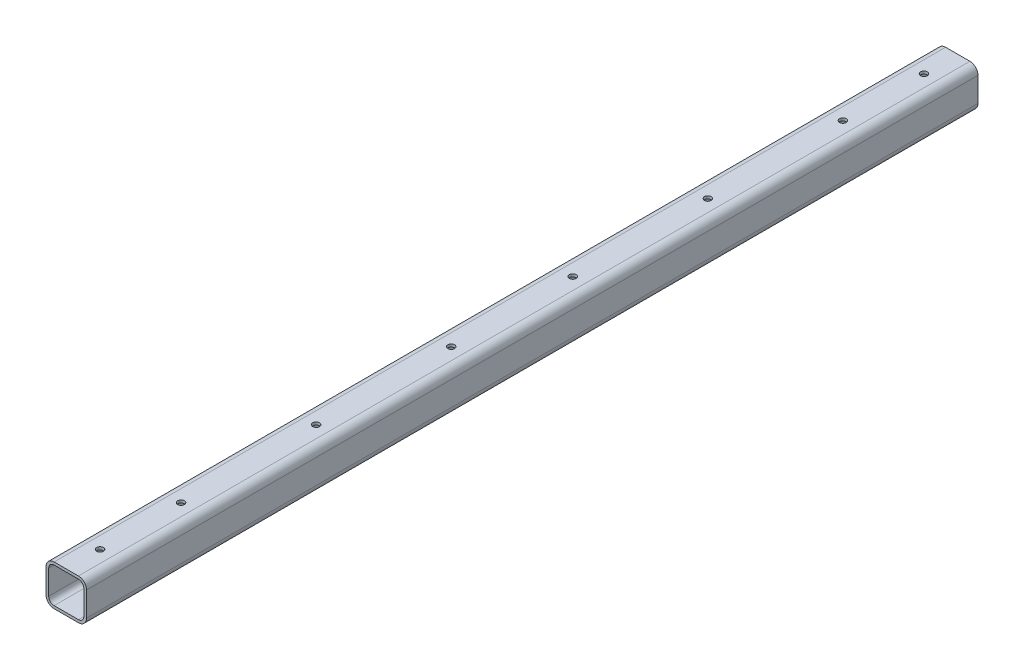
ISO-10303-21;
HEADER;
FILE_DESCRIPTION(('STEP AP214'),'2;1');
FILE_NAME('part.step','',(''),(''),'','','');
FILE_SCHEMA(('AUTOMOTIVE_DESIGN { 1 0 10303 214 1 1 1 1 }'));
ENDSEC;
DATA;
#1=APPLICATION_CONTEXT('core data for automotive mechanical design processes');
#2=APPLICATION_PROTOCOL_DEFINITION('international standard','automotive_design',2000,#1);
#3=PRODUCT_CONTEXT('',#1,'mechanical');
#4=PRODUCT('Part','Part','',(#3));
#5=PRODUCT_RELATED_PRODUCT_CATEGORY('part','',(#4));
#6=PRODUCT_DEFINITION_FORMATION('','',#4);
#7=PRODUCT_DEFINITION_CONTEXT('part definition',#1,'design');
#8=PRODUCT_DEFINITION('design','',#6,#7);
#9=PRODUCT_DEFINITION_SHAPE('','',#8);
#10=(LENGTH_UNIT() NAMED_UNIT(*) SI_UNIT(.MILLI.,.METRE.));
#11=(NAMED_UNIT(*) PLANE_ANGLE_UNIT() SI_UNIT($,.RADIAN.));
#12=(NAMED_UNIT(*) SI_UNIT($,.STERADIAN.) SOLID_ANGLE_UNIT());
#13=UNCERTAINTY_MEASURE_WITH_UNIT(LENGTH_MEASURE(1.E-05),#10,'distance_accuracy_value','');
#14=(GEOMETRIC_REPRESENTATION_CONTEXT(3) GLOBAL_UNCERTAINTY_ASSIGNED_CONTEXT((#13)) GLOBAL_UNIT_ASSIGNED_CONTEXT((#10,
#11,#12)) REPRESENTATION_CONTEXT('',''));
#15=CARTESIAN_POINT('',(0.,0.,0.));
#16=DIRECTION('',(0.,0.,1.));
#17=DIRECTION('',(1.,0.,0.));
#18=AXIS2_PLACEMENT_3D('',#15,#16,#17);
#19=CARTESIAN_POINT('',(9.,9.,330.));
#20=DIRECTION('',(0.,0.,-1.));
#21=DIRECTION('',(-1.,0.,0.));
#22=AXIS2_PLACEMENT_3D('',#19,#20,#21);
#23=PLANE('',#22);
#24=CARTESIAN_POINT('',(9.,9.,330.));
#25=DIRECTION('',(0.,0.,1.));
#26=DIRECTION('',(-1.,0.,0.));
#27=AXIS2_PLACEMENT_3D('',#24,#25,#26);
#28=CIRCLE('',#27,6.);
#29=CARTESIAN_POINT('',(15.,9.,330.));
#30=VERTEX_POINT('',#29);
#31=CARTESIAN_POINT('',(9.,15.,330.));
#32=VERTEX_POINT('',#31);
#33=EDGE_CURVE('E223',#30,#32,#28,.T.);
#34=ORIENTED_EDGE('',*,*,#33,.T.);
#35=DIRECTION('',(-1.,0.,0.));
#36=VECTOR('',#35,1.);
#37=CARTESIAN_POINT('',(-9.,15.,330.));
#38=LINE('',#37,#36);
#39=CARTESIAN_POINT('',(-9.,15.,330.));
#40=VERTEX_POINT('',#39);
#41=EDGE_CURVE('E226',#32,#40,#38,.T.);
#42=ORIENTED_EDGE('',*,*,#41,.T.);
#43=CARTESIAN_POINT('',(-9.,9.,330.));
#44=DIRECTION('',(0.,0.,1.));
#45=DIRECTION('',(1.,0.,0.));
#46=AXIS2_PLACEMENT_3D('',#43,#44,#45);
#47=CIRCLE('',#46,6.);
#48=CARTESIAN_POINT('',(-15.,9.,330.));
#49=VERTEX_POINT('',#48);
#50=EDGE_CURVE('E229',#40,#49,#47,.T.);
#51=ORIENTED_EDGE('',*,*,#50,.T.);
#52=DIRECTION('',(0.,-1.,0.));
#53=VECTOR('',#52,1.);
#54=CARTESIAN_POINT('',(-15.,9.,330.));
#55=LINE('',#54,#53);
#56=CARTESIAN_POINT('',(-15.,-9.,330.));
#57=VERTEX_POINT('',#56);
#58=EDGE_CURVE('E231',#49,#57,#55,.T.);
#59=ORIENTED_EDGE('',*,*,#58,.T.);
#60=CARTESIAN_POINT('',(-9.,-9.,330.));
#61=DIRECTION('',(0.,0.,1.));
#62=DIRECTION('',(-1.,0.,0.));
#63=AXIS2_PLACEMENT_3D('',#60,#61,#62);
#64=CIRCLE('',#63,6.);
#65=CARTESIAN_POINT('',(-9.,-15.,330.));
#66=VERTEX_POINT('',#65);
#67=EDGE_CURVE('E233',#57,#66,#64,.T.);
#68=ORIENTED_EDGE('',*,*,#67,.T.);
#69=DIRECTION('',(1.,0.,0.));
#70=VECTOR('',#69,1.);
#71=CARTESIAN_POINT('',(-9.,-15.,330.));
#72=LINE('',#71,#70);
#73=CARTESIAN_POINT('',(9.,-15.,330.));
#74=VERTEX_POINT('',#73);
#75=EDGE_CURVE('E235',#66,#74,#72,.T.);
#76=ORIENTED_EDGE('',*,*,#75,.T.);
#77=CARTESIAN_POINT('',(9.,-9.,330.));
#78=DIRECTION('',(0.,0.,1.));
#79=DIRECTION('',(1.,0.,0.));
#80=AXIS2_PLACEMENT_3D('',#77,#78,#79);
#81=CIRCLE('',#80,6.);
#82=CARTESIAN_POINT('',(15.,-9.,330.));
#83=VERTEX_POINT('',#82);
#84=EDGE_CURVE('E237',#74,#83,#81,.T.);
#85=ORIENTED_EDGE('',*,*,#84,.T.);
#86=DIRECTION('',(0.,1.,0.));
#87=VECTOR('',#86,1.);
#88=CARTESIAN_POINT('',(15.,9.,330.));
#89=LINE('',#88,#87);
#90=EDGE_CURVE('E239',#83,#30,#89,.T.);
#91=ORIENTED_EDGE('',*,*,#90,.T.);
#92=EDGE_LOOP('',(#34,#42,#51,#59,#68,#76,#85,#91));
#93=FACE_BOUND('',#92,.T.);
#94=CARTESIAN_POINT('',(-9.,9.,330.));
#95=DIRECTION('',(0.,0.,1.));
#96=DIRECTION('',(1.,0.,0.));
#97=AXIS2_PLACEMENT_3D('',#94,#95,#96);
#98=CIRCLE('',#97,4.);
#99=CARTESIAN_POINT('',(-9.,13.,330.));
#100=VERTEX_POINT('',#99);
#101=CARTESIAN_POINT('',(-13.,9.,330.));
#102=VERTEX_POINT('',#101);
#103=EDGE_CURVE('E156',#100,#102,#98,.T.);
#104=ORIENTED_EDGE('',*,*,#103,.F.);
#105=DIRECTION('',(-1.,0.,0.));
#106=VECTOR('',#105,1.);
#107=CARTESIAN_POINT('',(-9.,13.,330.));
#108=LINE('',#107,#106);
#109=CARTESIAN_POINT('',(9.,13.,330.));
#110=VERTEX_POINT('',#109);
#111=EDGE_CURVE('E190',#110,#100,#108,.T.);
#112=ORIENTED_EDGE('',*,*,#111,.F.);
#113=CARTESIAN_POINT('',(9.,9.,330.));
#114=DIRECTION('',(0.,0.,1.));
#115=DIRECTION('',(-1.,0.,0.));
#116=AXIS2_PLACEMENT_3D('',#113,#114,#115);
#117=CIRCLE('',#116,4.);
#118=CARTESIAN_POINT('',(13.,9.,330.));
#119=VERTEX_POINT('',#118);
#120=EDGE_CURVE('E188',#119,#110,#117,.T.);
#121=ORIENTED_EDGE('',*,*,#120,.F.);
#122=DIRECTION('',(0.,1.,0.));
#123=VECTOR('',#122,1.);
#124=CARTESIAN_POINT('',(13.,9.,330.));
#125=LINE('',#124,#123);
#126=CARTESIAN_POINT('',(13.,-9.,330.));
#127=VERTEX_POINT('',#126);
#128=EDGE_CURVE('E186',#127,#119,#125,.T.);
#129=ORIENTED_EDGE('',*,*,#128,.F.);
#130=CARTESIAN_POINT('',(9.,-9.,330.));
#131=DIRECTION('',(0.,0.,1.));
#132=DIRECTION('',(1.,0.,0.));
#133=AXIS2_PLACEMENT_3D('',#130,#131,#132);
#134=CIRCLE('',#133,4.);
#135=CARTESIAN_POINT('',(9.,-13.,330.));
#136=VERTEX_POINT('',#135);
#137=EDGE_CURVE('E184',#136,#127,#134,.T.);
#138=ORIENTED_EDGE('',*,*,#137,.F.);
#139=DIRECTION('',(1.,0.,0.));
#140=VECTOR('',#139,1.);
#141=CARTESIAN_POINT('',(-9.,-13.,330.));
#142=LINE('',#141,#140);
#143=CARTESIAN_POINT('',(-9.,-13.,330.));
#144=VERTEX_POINT('',#143);
#145=EDGE_CURVE('E179',#144,#136,#142,.T.);
#146=ORIENTED_EDGE('',*,*,#145,.F.);
#147=CARTESIAN_POINT('',(-9.,-9.,330.));
#148=DIRECTION('',(0.,0.,1.));
#149=DIRECTION('',(-1.,0.,0.));
#150=AXIS2_PLACEMENT_3D('',#147,#148,#149);
#151=CIRCLE('',#150,4.);
#152=CARTESIAN_POINT('',(-13.,-9.,330.));
#153=VERTEX_POINT('',#152);
#154=EDGE_CURVE('E177',#153,#144,#151,.T.);
#155=ORIENTED_EDGE('',*,*,#154,.F.);
#156=DIRECTION('',(0.,-1.,0.));
#157=VECTOR('',#156,1.);
#158=CARTESIAN_POINT('',(-13.,9.,330.));
#159=LINE('',#158,#157);
#160=EDGE_CURVE('E164',#102,#153,#159,.T.);
#161=ORIENTED_EDGE('',*,*,#160,.F.);
#162=EDGE_LOOP('',(#104,#112,#121,#129,#138,#146,#155,#161));
#163=FACE_BOUND('',#162,.T.);
#164=ADVANCED_FACE('F41',(#93,#163),#23,.F.);
#165=CARTESIAN_POINT('',(9.,9.,-330.));
#166=DIRECTION('',(0.,0.,-1.));
#167=DIRECTION('',(-1.,0.,0.));
#168=AXIS2_PLACEMENT_3D('',#165,#166,#167);
#169=PLANE('',#168);
#170=CARTESIAN_POINT('',(9.,9.,-330.));
#171=DIRECTION('',(0.,0.,1.));
#172=DIRECTION('',(-1.,0.,0.));
#173=AXIS2_PLACEMENT_3D('',#170,#171,#172);
#174=CIRCLE('',#173,6.);
#175=CARTESIAN_POINT('',(15.,9.,-330.));
#176=VERTEX_POINT('',#175);
#177=CARTESIAN_POINT('',(9.,15.,-330.));
#178=VERTEX_POINT('',#177);
#179=EDGE_CURVE('E172',#176,#178,#174,.T.);
#180=ORIENTED_EDGE('',*,*,#179,.F.);
#181=DIRECTION('',(0.,1.,0.));
#182=VECTOR('',#181,1.);
#183=CARTESIAN_POINT('',(15.,9.,-330.));
#184=LINE('',#183,#182);
#185=CARTESIAN_POINT('',(15.,-9.,-330.));
#186=VERTEX_POINT('',#185);
#187=EDGE_CURVE('E227',#186,#176,#184,.T.);
#188=ORIENTED_EDGE('',*,*,#187,.F.);
#189=CARTESIAN_POINT('',(9.,-9.,-330.));
#190=DIRECTION('',(0.,0.,1.));
#191=DIRECTION('',(1.,0.,0.));
#192=AXIS2_PLACEMENT_3D('',#189,#190,#191);
#193=CIRCLE('',#192,6.);
#194=CARTESIAN_POINT('',(9.,-15.,-330.));
#195=VERTEX_POINT('',#194);
#196=EDGE_CURVE('E254',#195,#186,#193,.T.);
#197=ORIENTED_EDGE('',*,*,#196,.F.);
#198=DIRECTION('',(1.,0.,0.));
#199=VECTOR('',#198,1.);
#200=CARTESIAN_POINT('',(-9.,-15.,-330.));
#201=LINE('',#200,#199);
#202=CARTESIAN_POINT('',(-9.,-15.,-330.));
#203=VERTEX_POINT('',#202);
#204=EDGE_CURVE('E252',#203,#195,#201,.T.);
#205=ORIENTED_EDGE('',*,*,#204,.F.);
#206=CARTESIAN_POINT('',(-9.,-9.,-330.));
#207=DIRECTION('',(0.,0.,1.));
#208=DIRECTION('',(-1.,0.,0.));
#209=AXIS2_PLACEMENT_3D('',#206,#207,#208);
#210=CIRCLE('',#209,6.);
#211=CARTESIAN_POINT('',(-15.,-9.,-330.));
#212=VERTEX_POINT('',#211);
#213=EDGE_CURVE('E250',#212,#203,#210,.T.);
#214=ORIENTED_EDGE('',*,*,#213,.F.);
#215=DIRECTION('',(0.,-1.,0.));
#216=VECTOR('',#215,1.);
#217=CARTESIAN_POINT('',(-15.,9.,-330.));
#218=LINE('',#217,#216);
#219=CARTESIAN_POINT('',(-15.,9.,-330.));
#220=VERTEX_POINT('',#219);
#221=EDGE_CURVE('E248',#220,#212,#218,.T.);
#222=ORIENTED_EDGE('',*,*,#221,.F.);
#223=CARTESIAN_POINT('',(-9.,9.,-330.));
#224=DIRECTION('',(0.,0.,1.));
#225=DIRECTION('',(1.,0.,0.));
#226=AXIS2_PLACEMENT_3D('',#223,#224,#225);
#227=CIRCLE('',#226,6.);
#228=CARTESIAN_POINT('',(-9.,15.,-330.));
#229=VERTEX_POINT('',#228);
#230=EDGE_CURVE('E246',#229,#220,#227,.T.);
#231=ORIENTED_EDGE('',*,*,#230,.F.);
#232=DIRECTION('',(-1.,0.,0.));
#233=VECTOR('',#232,1.);
#234=CARTESIAN_POINT('',(-9.,15.,-330.));
#235=LINE('',#234,#233);
#236=EDGE_CURVE('E244',#178,#229,#235,.T.);
#237=ORIENTED_EDGE('',*,*,#236,.F.);
#238=EDGE_LOOP('',(#180,#188,#197,#205,#214,#222,#231,#237));
#239=FACE_BOUND('',#238,.T.);
#240=DIRECTION('',(-1.,0.,0.));
#241=VECTOR('',#240,1.);
#242=CARTESIAN_POINT('',(-9.,13.,-330.));
#243=LINE('',#242,#241);
#244=CARTESIAN_POINT('',(9.,13.,-330.));
#245=VERTEX_POINT('',#244);
#246=CARTESIAN_POINT('',(-9.,13.,-330.));
#247=VERTEX_POINT('',#246);
#248=EDGE_CURVE('E165',#245,#247,#243,.T.);
#249=ORIENTED_EDGE('',*,*,#248,.T.);
#250=CARTESIAN_POINT('',(-9.,9.,-330.));
#251=DIRECTION('',(0.,0.,1.));
#252=DIRECTION('',(1.,0.,0.));
#253=AXIS2_PLACEMENT_3D('',#250,#251,#252);
#254=CIRCLE('',#253,4.);
#255=CARTESIAN_POINT('',(-13.,9.,-330.));
#256=VERTEX_POINT('',#255);
#257=EDGE_CURVE('E66',#247,#256,#254,.T.);
#258=ORIENTED_EDGE('',*,*,#257,.T.);
#259=DIRECTION('',(0.,-1.,0.));
#260=VECTOR('',#259,1.);
#261=CARTESIAN_POINT('',(-13.,9.,-330.));
#262=LINE('',#261,#260);
#263=CARTESIAN_POINT('',(-13.,-9.,-330.));
#264=VERTEX_POINT('',#263);
#265=EDGE_CURVE('E171',#256,#264,#262,.T.);
#266=ORIENTED_EDGE('',*,*,#265,.T.);
#267=CARTESIAN_POINT('',(-9.,-9.,-330.));
#268=DIRECTION('',(0.,0.,1.));
#269=DIRECTION('',(-1.,0.,0.));
#270=AXIS2_PLACEMENT_3D('',#267,#268,#269);
#271=CIRCLE('',#270,4.);
#272=CARTESIAN_POINT('',(-9.,-13.,-330.));
#273=VERTEX_POINT('',#272);
#274=EDGE_CURVE('E195',#264,#273,#271,.T.);
#275=ORIENTED_EDGE('',*,*,#274,.T.);
#276=DIRECTION('',(1.,0.,0.));
#277=VECTOR('',#276,1.);
#278=CARTESIAN_POINT('',(-9.,-13.,-330.));
#279=LINE('',#278,#277);
#280=CARTESIAN_POINT('',(9.,-13.,-330.));
#281=VERTEX_POINT('',#280);
#282=EDGE_CURVE('E198',#273,#281,#279,.T.);
#283=ORIENTED_EDGE('',*,*,#282,.T.);
#284=CARTESIAN_POINT('',(9.,-9.,-330.));
#285=DIRECTION('',(0.,0.,1.));
#286=DIRECTION('',(1.,0.,0.));
#287=AXIS2_PLACEMENT_3D('',#284,#285,#286);
#288=CIRCLE('',#287,4.);
#289=CARTESIAN_POINT('',(13.,-9.,-330.));
#290=VERTEX_POINT('',#289);
#291=EDGE_CURVE('E201',#281,#290,#288,.T.);
#292=ORIENTED_EDGE('',*,*,#291,.T.);
#293=DIRECTION('',(0.,1.,0.));
#294=VECTOR('',#293,1.);
#295=CARTESIAN_POINT('',(13.,9.,-330.));
#296=LINE('',#295,#294);
#297=CARTESIAN_POINT('',(13.,9.,-330.));
#298=VERTEX_POINT('',#297);
#299=EDGE_CURVE('E204',#290,#298,#296,.T.);
#300=ORIENTED_EDGE('',*,*,#299,.T.);
#301=CARTESIAN_POINT('',(9.,9.,-330.));
#302=DIRECTION('',(0.,0.,1.));
#303=DIRECTION('',(-1.,0.,0.));
#304=AXIS2_PLACEMENT_3D('',#301,#302,#303);
#305=CIRCLE('',#304,4.);
#306=EDGE_CURVE('E207',#298,#245,#305,.T.);
#307=ORIENTED_EDGE('',*,*,#306,.T.);
#308=EDGE_LOOP('',(#249,#258,#266,#275,#283,#292,#300,#307));
#309=FACE_BOUND('',#308,.T.);
#310=ADVANCED_FACE('F354',(#239,#309),#169,.T.);
#311=CARTESIAN_POINT('',(9.,9.,330.));
#312=DIRECTION('',(0.,0.,-1.));
#313=DIRECTION('',(-1.,0.,0.));
#314=AXIS2_PLACEMENT_3D('',#311,#312,#313);
#315=CYLINDRICAL_SURFACE('',#314,6.);
#316=ORIENTED_EDGE('',*,*,#179,.T.);
#317=DIRECTION('',(0.,0.,-1.));
#318=VECTOR('',#317,1.);
#319=CARTESIAN_POINT('',(9.,15.,330.));
#320=LINE('',#319,#318);
#321=EDGE_CURVE('E11',#32,#178,#320,.T.);
#322=ORIENTED_EDGE('',*,*,#321,.F.);
#323=ORIENTED_EDGE('',*,*,#33,.F.);
#324=DIRECTION('',(0.,0.,-1.));
#325=VECTOR('',#324,1.);
#326=CARTESIAN_POINT('',(15.,9.,330.));
#327=LINE('',#326,#325);
#328=EDGE_CURVE('E241',#30,#176,#327,.T.);
#329=ORIENTED_EDGE('',*,*,#328,.T.);
#330=EDGE_LOOP('',(#316,#322,#323,#329));
#331=FACE_BOUND('',#330,.T.);
#332=ADVANCED_FACE('F43',(#331),#315,.T.);
#333=CARTESIAN_POINT('',(-9.,15.,330.));
#334=DIRECTION('',(0.,-1.,0.));
#335=DIRECTION('',(0.,0.,-1.));
#336=AXIS2_PLACEMENT_3D('',#333,#334,#335);
#337=PLANE('',#336);
#338=CARTESIAN_POINT('',(0.,15.,-305.));
#339=DIRECTION('',(0.,-1.,0.));
#340=DIRECTION('',(0.,0.,-1.));
#341=AXIS2_PLACEMENT_3D('',#338,#339,#340);
#342=CIRCLE('',#341,2.5);
#343=CARTESIAN_POINT('',(0.,15.,-307.5));
#344=VERTEX_POINT('',#343);
#345=EDGE_CURVE('E193',#344,#344,#342,.T.);
#346=ORIENTED_EDGE('',*,*,#345,.T.);
#347=EDGE_LOOP('',(#346));
#348=FACE_BOUND('',#347,.T.);
#349=CARTESIAN_POINT('',(0.,15.,-245.));
#350=DIRECTION('',(0.,-1.,0.));
#351=DIRECTION('',(0.,0.,-1.));
#352=AXIS2_PLACEMENT_3D('',#349,#350,#351);
#353=CIRCLE('',#352,2.5);
#354=CARTESIAN_POINT('',(0.,15.,-247.5));
#355=VERTEX_POINT('',#354);
#356=EDGE_CURVE('E312',#355,#355,#353,.T.);
#357=ORIENTED_EDGE('',*,*,#356,.T.);
#358=EDGE_LOOP('',(#357));
#359=FACE_BOUND('',#358,.T.);
#360=CARTESIAN_POINT('',(0.,15.,-145.));
#361=DIRECTION('',(0.,-1.,0.));
#362=DIRECTION('',(0.,0.,-1.));
#363=AXIS2_PLACEMENT_3D('',#360,#361,#362);
#364=CIRCLE('',#363,2.5);
#365=CARTESIAN_POINT('',(0.,15.,-147.5));
#366=VERTEX_POINT('',#365);
#367=EDGE_CURVE('E308',#366,#366,#364,.T.);
#368=ORIENTED_EDGE('',*,*,#367,.T.);
#369=EDGE_LOOP('',(#368));
#370=FACE_BOUND('',#369,.T.);
#371=CARTESIAN_POINT('',(0.,15.,-45.));
#372=DIRECTION('',(0.,-1.,0.));
#373=DIRECTION('',(0.,0.,-1.));
#374=AXIS2_PLACEMENT_3D('',#371,#372,#373);
#375=CIRCLE('',#374,2.5);
#376=CARTESIAN_POINT('',(0.,15.,-47.5));
#377=VERTEX_POINT('',#376);
#378=EDGE_CURVE('E304',#377,#377,#375,.T.);
#379=ORIENTED_EDGE('',*,*,#378,.T.);
#380=EDGE_LOOP('',(#379));
#381=FACE_BOUND('',#380,.T.);
#382=CARTESIAN_POINT('',(0.,15.,45.));
#383=DIRECTION('',(0.,-1.,0.));
#384=DIRECTION('',(0.,0.,-1.));
#385=AXIS2_PLACEMENT_3D('',#382,#383,#384);
#386=CIRCLE('',#385,2.5);
#387=CARTESIAN_POINT('',(0.,15.,42.5));
#388=VERTEX_POINT('',#387);
#389=EDGE_CURVE('E300',#388,#388,#386,.T.);
#390=ORIENTED_EDGE('',*,*,#389,.T.);
#391=EDGE_LOOP('',(#390));
#392=FACE_BOUND('',#391,.T.);
#393=CARTESIAN_POINT('',(0.,15.,145.));
#394=DIRECTION('',(0.,-1.,0.));
#395=DIRECTION('',(0.,0.,-1.));
#396=AXIS2_PLACEMENT_3D('',#393,#394,#395);
#397=CIRCLE('',#396,2.5);
#398=CARTESIAN_POINT('',(0.,15.,142.5));
#399=VERTEX_POINT('',#398);
#400=EDGE_CURVE('E295',#399,#399,#397,.T.);
#401=ORIENTED_EDGE('',*,*,#400,.T.);
#402=EDGE_LOOP('',(#401));
#403=FACE_BOUND('',#402,.T.);
#404=CARTESIAN_POINT('',(0.,15.,245.));
#405=DIRECTION('',(0.,-1.,0.));
#406=DIRECTION('',(0.,0.,-1.));
#407=AXIS2_PLACEMENT_3D('',#404,#405,#406);
#408=CIRCLE('',#407,2.5);
#409=CARTESIAN_POINT('',(0.,15.,242.5));
#410=VERTEX_POINT('',#409);
#411=EDGE_CURVE('E290',#410,#410,#408,.T.);
#412=ORIENTED_EDGE('',*,*,#411,.T.);
#413=EDGE_LOOP('',(#412));
#414=FACE_BOUND('',#413,.T.);
#415=CARTESIAN_POINT('',(0.,15.,305.));
#416=DIRECTION('',(0.,-1.,0.));
#417=DIRECTION('',(0.,0.,-1.));
#418=AXIS2_PLACEMENT_3D('',#415,#416,#417);
#419=CIRCLE('',#418,2.5);
#420=CARTESIAN_POINT('',(0.,15.,302.5));
#421=VERTEX_POINT('',#420);
#422=EDGE_CURVE('E285',#421,#421,#419,.T.);
#423=ORIENTED_EDGE('',*,*,#422,.T.);
#424=EDGE_LOOP('',(#423));
#425=FACE_BOUND('',#424,.T.);
#426=ORIENTED_EDGE('',*,*,#236,.T.);
#427=DIRECTION('',(0.,0.,-1.));
#428=VECTOR('',#427,1.);
#429=CARTESIAN_POINT('',(-9.,15.,330.));
#430=LINE('',#429,#428);
#431=EDGE_CURVE('E50',#40,#229,#430,.T.);
#432=ORIENTED_EDGE('',*,*,#431,.F.);
#433=ORIENTED_EDGE('',*,*,#41,.F.);
#434=ORIENTED_EDGE('',*,*,#321,.T.);
#435=EDGE_LOOP('',(#426,#432,#433,#434));
#436=FACE_BOUND('',#435,.T.);
#437=ADVANCED_FACE('F329',(#348,#359,#370,#381,#392,#403,#414,#425,#436),#337,.F.);
#438=CARTESIAN_POINT('',(-9.,9.,330.));
#439=DIRECTION('',(0.,0.,-1.));
#440=DIRECTION('',(-1.,0.,0.));
#441=AXIS2_PLACEMENT_3D('',#438,#439,#440);
#442=CYLINDRICAL_SURFACE('',#441,6.);
#443=ORIENTED_EDGE('',*,*,#230,.T.);
#444=DIRECTION('',(0.,0.,-1.));
#445=VECTOR('',#444,1.);
#446=CARTESIAN_POINT('',(-15.,9.,330.));
#447=LINE('',#446,#445);
#448=EDGE_CURVE('E271',#49,#220,#447,.T.);
#449=ORIENTED_EDGE('',*,*,#448,.F.);
#450=ORIENTED_EDGE('',*,*,#50,.F.);
#451=ORIENTED_EDGE('',*,*,#431,.T.);
#452=EDGE_LOOP('',(#443,#449,#450,#451));
#453=FACE_BOUND('',#452,.T.);
#454=ADVANCED_FACE('F384',(#453),#442,.T.);
#455=CARTESIAN_POINT('',(-15.,9.,330.));
#456=DIRECTION('',(1.,0.,0.));
#457=DIRECTION('',(0.,0.,-1.));
#458=AXIS2_PLACEMENT_3D('',#455,#456,#457);
#459=PLANE('',#458);
#460=ORIENTED_EDGE('',*,*,#221,.T.);
#461=DIRECTION('',(0.,0.,-1.));
#462=VECTOR('',#461,1.);
#463=CARTESIAN_POINT('',(-15.,-9.,330.));
#464=LINE('',#463,#462);
#465=EDGE_CURVE('E268',#57,#212,#464,.T.);
#466=ORIENTED_EDGE('',*,*,#465,.F.);
#467=ORIENTED_EDGE('',*,*,#58,.F.);
#468=ORIENTED_EDGE('',*,*,#448,.T.);
#469=EDGE_LOOP('',(#460,#466,#467,#468));
#470=FACE_BOUND('',#469,.T.);
#471=ADVANCED_FACE('F380',(#470),#459,.F.);
#472=CARTESIAN_POINT('',(-9.,-9.,330.));
#473=DIRECTION('',(0.,0.,-1.));
#474=DIRECTION('',(-1.,0.,0.));
#475=AXIS2_PLACEMENT_3D('',#472,#473,#474);
#476=CYLINDRICAL_SURFACE('',#475,6.);
#477=ORIENTED_EDGE('',*,*,#213,.T.);
#478=DIRECTION('',(0.,0.,-1.));
#479=VECTOR('',#478,1.);
#480=CARTESIAN_POINT('',(-9.,-15.,330.));
#481=LINE('',#480,#479);
#482=EDGE_CURVE('E265',#66,#203,#481,.T.);
#483=ORIENTED_EDGE('',*,*,#482,.F.);
#484=ORIENTED_EDGE('',*,*,#67,.F.);
#485=ORIENTED_EDGE('',*,*,#465,.T.);
#486=EDGE_LOOP('',(#477,#483,#484,#485));
#487=FACE_BOUND('',#486,.T.);
#488=ADVANCED_FACE('F376',(#487),#476,.T.);
#489=CARTESIAN_POINT('',(-9.,-15.,330.));
#490=DIRECTION('',(0.,1.,0.));
#491=DIRECTION('',(0.,0.,1.));
#492=AXIS2_PLACEMENT_3D('',#489,#490,#491);
#493=PLANE('',#492);
#494=CARTESIAN_POINT('',(0.,-15.,-305.));
#495=DIRECTION('',(0.,-1.,0.));
#496=DIRECTION('',(0.,0.,-1.));
#497=AXIS2_PLACEMENT_3D('',#494,#495,#496);
#498=CIRCLE('',#497,2.5);
#499=CARTESIAN_POINT('',(0.,-15.,-307.5));
#500=VERTEX_POINT('',#499);
#501=EDGE_CURVE('E280',#500,#500,#498,.T.);
#502=ORIENTED_EDGE('',*,*,#501,.F.);
#503=EDGE_LOOP('',(#502));
#504=FACE_BOUND('',#503,.T.);
#505=CARTESIAN_POINT('',(0.,-15.,-245.));
#506=DIRECTION('',(0.,-1.,0.));
#507=DIRECTION('',(0.,0.,-1.));
#508=AXIS2_PLACEMENT_3D('',#505,#506,#507);
#509=CIRCLE('',#508,2.5);
#510=CARTESIAN_POINT('',(0.,-15.,-247.5));
#511=VERTEX_POINT('',#510);
#512=EDGE_CURVE('E504',#511,#511,#509,.T.);
#513=ORIENTED_EDGE('',*,*,#512,.F.);
#514=EDGE_LOOP('',(#513));
#515=FACE_BOUND('',#514,.T.);
#516=CARTESIAN_POINT('',(0.,-15.,-145.));
#517=DIRECTION('',(0.,-1.,0.));
#518=DIRECTION('',(0.,0.,-1.));
#519=AXIS2_PLACEMENT_3D('',#516,#517,#518);
#520=CIRCLE('',#519,2.5);
#521=CARTESIAN_POINT('',(0.,-15.,-147.5));
#522=VERTEX_POINT('',#521);
#523=EDGE_CURVE('E502',#522,#522,#520,.T.);
#524=ORIENTED_EDGE('',*,*,#523,.F.);
#525=EDGE_LOOP('',(#524));
#526=FACE_BOUND('',#525,.T.);
#527=CARTESIAN_POINT('',(0.,-15.,-45.));
#528=DIRECTION('',(0.,-1.,0.));
#529=DIRECTION('',(0.,0.,-1.));
#530=AXIS2_PLACEMENT_3D('',#527,#528,#529);
#531=CIRCLE('',#530,2.5);
#532=CARTESIAN_POINT('',(0.,-15.,-47.5));
#533=VERTEX_POINT('',#532);
#534=EDGE_CURVE('E505',#533,#533,#531,.T.);
#535=ORIENTED_EDGE('',*,*,#534,.F.);
#536=EDGE_LOOP('',(#535));
#537=FACE_BOUND('',#536,.T.);
#538=CARTESIAN_POINT('',(0.,-15.,45.));
#539=DIRECTION('',(0.,-1.,0.));
#540=DIRECTION('',(0.,0.,1.));
#541=AXIS2_PLACEMENT_3D('',#538,#539,#540);
#542=CIRCLE('',#541,2.5);
#543=CARTESIAN_POINT('',(0.,-15.,47.5));
#544=VERTEX_POINT('',#543);
#545=EDGE_CURVE('E510',#544,#544,#542,.T.);
#546=ORIENTED_EDGE('',*,*,#545,.F.);
#547=EDGE_LOOP('',(#546));
#548=FACE_BOUND('',#547,.T.);
#549=CARTESIAN_POINT('',(0.,-15.,145.));
#550=DIRECTION('',(0.,-1.,0.));
#551=DIRECTION('',(0.,0.,1.));
#552=AXIS2_PLACEMENT_3D('',#549,#550,#551);
#553=CIRCLE('',#552,2.5);
#554=CARTESIAN_POINT('',(0.,-15.,147.5));
#555=VERTEX_POINT('',#554);
#556=EDGE_CURVE('E516',#555,#555,#553,.T.);
#557=ORIENTED_EDGE('',*,*,#556,.F.);
#558=EDGE_LOOP('',(#557));
#559=FACE_BOUND('',#558,.T.);
#560=CARTESIAN_POINT('',(0.,-15.,245.));
#561=DIRECTION('',(0.,-1.,0.));
#562=DIRECTION('',(0.,0.,1.));
#563=AXIS2_PLACEMENT_3D('',#560,#561,#562);
#564=CIRCLE('',#563,2.5);
#565=CARTESIAN_POINT('',(0.,-15.,247.5));
#566=VERTEX_POINT('',#565);
#567=EDGE_CURVE('E519',#566,#566,#564,.T.);
#568=ORIENTED_EDGE('',*,*,#567,.F.);
#569=EDGE_LOOP('',(#568));
#570=FACE_BOUND('',#569,.T.);
#571=CARTESIAN_POINT('',(0.,-15.,305.));
#572=DIRECTION('',(0.,-1.,0.));
#573=DIRECTION('',(0.,0.,1.));
#574=AXIS2_PLACEMENT_3D('',#571,#572,#573);
#575=CIRCLE('',#574,2.5);
#576=CARTESIAN_POINT('',(0.,-15.,307.5));
#577=VERTEX_POINT('',#576);
#578=EDGE_CURVE('E522',#577,#577,#575,.T.);
#579=ORIENTED_EDGE('',*,*,#578,.F.);
#580=EDGE_LOOP('',(#579));
#581=FACE_BOUND('',#580,.T.);
#582=ORIENTED_EDGE('',*,*,#204,.T.);
#583=DIRECTION('',(0.,0.,-1.));
#584=VECTOR('',#583,1.);
#585=CARTESIAN_POINT('',(9.,-15.,330.));
#586=LINE('',#585,#584);
#587=EDGE_CURVE('E262',#74,#195,#586,.T.);
#588=ORIENTED_EDGE('',*,*,#587,.F.);
#589=ORIENTED_EDGE('',*,*,#75,.F.);
#590=ORIENTED_EDGE('',*,*,#482,.T.);
#591=EDGE_LOOP('',(#582,#588,#589,#590));
#592=FACE_BOUND('',#591,.T.);
#593=ADVANCED_FACE('F372',(#504,#515,#526,#537,#548,#559,#570,#581,#592),#493,.F.);
#594=CARTESIAN_POINT('',(9.,-9.,330.));
#595=DIRECTION('',(0.,0.,-1.));
#596=DIRECTION('',(-1.,0.,0.));
#597=AXIS2_PLACEMENT_3D('',#594,#595,#596);
#598=CYLINDRICAL_SURFACE('',#597,6.);
#599=ORIENTED_EDGE('',*,*,#196,.T.);
#600=DIRECTION('',(0.,0.,-1.));
#601=VECTOR('',#600,1.);
#602=CARTESIAN_POINT('',(15.,-9.,330.));
#603=LINE('',#602,#601);
#604=EDGE_CURVE('E259',#83,#186,#603,.T.);
#605=ORIENTED_EDGE('',*,*,#604,.F.);
#606=ORIENTED_EDGE('',*,*,#84,.F.);
#607=ORIENTED_EDGE('',*,*,#587,.T.);
#608=EDGE_LOOP('',(#599,#605,#606,#607));
#609=FACE_BOUND('',#608,.T.);
#610=ADVANCED_FACE('F368',(#609),#598,.T.);
#611=CARTESIAN_POINT('',(15.,9.,330.));
#612=DIRECTION('',(-1.,0.,0.));
#613=DIRECTION('',(0.,0.,1.));
#614=AXIS2_PLACEMENT_3D('',#611,#612,#613);
#615=PLANE('',#614);
#616=ORIENTED_EDGE('',*,*,#187,.T.);
#617=ORIENTED_EDGE('',*,*,#328,.F.);
#618=ORIENTED_EDGE('',*,*,#90,.F.);
#619=ORIENTED_EDGE('',*,*,#604,.T.);
#620=EDGE_LOOP('',(#616,#617,#618,#619));
#621=FACE_BOUND('',#620,.T.);
#622=ADVANCED_FACE('F365',(#621),#615,.F.);
#623=CARTESIAN_POINT('',(-9.,9.,330.));
#624=DIRECTION('',(0.,0.,-1.));
#625=DIRECTION('',(-1.,0.,0.));
#626=AXIS2_PLACEMENT_3D('',#623,#624,#625);
#627=CYLINDRICAL_SURFACE('',#626,4.);
#628=ORIENTED_EDGE('',*,*,#257,.F.);
#629=DIRECTION('',(0.,0.,-1.));
#630=VECTOR('',#629,1.);
#631=CARTESIAN_POINT('',(-9.,13.,330.));
#632=LINE('',#631,#630);
#633=EDGE_CURVE('E160',#100,#247,#632,.T.);
#634=ORIENTED_EDGE('',*,*,#633,.F.);
#635=ORIENTED_EDGE('',*,*,#103,.T.);
#636=DIRECTION('',(0.,0.,-1.));
#637=VECTOR('',#636,1.);
#638=CARTESIAN_POINT('',(-13.,9.,330.));
#639=LINE('',#638,#637);
#640=EDGE_CURVE('E159',#102,#256,#639,.T.);
#641=ORIENTED_EDGE('',*,*,#640,.T.);
#642=EDGE_LOOP('',(#628,#634,#635,#641));
#643=FACE_BOUND('',#642,.T.);
#644=ADVANCED_FACE('F158',(#643),#627,.F.);
#645=CARTESIAN_POINT('',(-13.,9.,330.));
#646=DIRECTION('',(1.,0.,0.));
#647=DIRECTION('',(0.,1.,0.));
#648=AXIS2_PLACEMENT_3D('',#645,#646,#647);
#649=PLANE('',#648);
#650=ORIENTED_EDGE('',*,*,#265,.F.);
#651=ORIENTED_EDGE('',*,*,#640,.F.);
#652=ORIENTED_EDGE('',*,*,#160,.T.);
#653=DIRECTION('',(0.,0.,-1.));
#654=VECTOR('',#653,1.);
#655=CARTESIAN_POINT('',(-13.,-9.,330.));
#656=LINE('',#655,#654);
#657=EDGE_CURVE('E173',#153,#264,#656,.T.);
#658=ORIENTED_EDGE('',*,*,#657,.T.);
#659=EDGE_LOOP('',(#650,#651,#652,#658));
#660=FACE_BOUND('',#659,.T.);
#661=ADVANCED_FACE('F168',(#660),#649,.T.);
#662=CARTESIAN_POINT('',(-9.,-9.,330.));
#663=DIRECTION('',(0.,0.,-1.));
#664=DIRECTION('',(-1.,0.,0.));
#665=AXIS2_PLACEMENT_3D('',#662,#663,#664);
#666=CYLINDRICAL_SURFACE('',#665,4.);
#667=ORIENTED_EDGE('',*,*,#274,.F.);
#668=ORIENTED_EDGE('',*,*,#657,.F.);
#669=ORIENTED_EDGE('',*,*,#154,.T.);
#670=DIRECTION('',(0.,0.,-1.));
#671=VECTOR('',#670,1.);
#672=CARTESIAN_POINT('',(-9.,-13.,330.));
#673=LINE('',#672,#671);
#674=EDGE_CURVE('E220',#144,#273,#673,.T.);
#675=ORIENTED_EDGE('',*,*,#674,.T.);
#676=EDGE_LOOP('',(#667,#668,#669,#675));
#677=FACE_BOUND('',#676,.T.);
#678=ADVANCED_FACE('F443',(#677),#666,.F.);
#679=CARTESIAN_POINT('',(-9.,-13.,330.));
#680=DIRECTION('',(0.,1.,0.));
#681=DIRECTION('',(0.,0.,1.));
#682=AXIS2_PLACEMENT_3D('',#679,#680,#681);
#683=PLANE('',#682);
#684=CARTESIAN_POINT('',(0.,-13.,-305.));
#685=DIRECTION('',(0.,1.,0.));
#686=DIRECTION('',(0.,0.,1.));
#687=AXIS2_PLACEMENT_3D('',#684,#685,#686);
#688=CIRCLE('',#687,2.5);
#689=CARTESIAN_POINT('',(0.,-13.,-302.5));
#690=VERTEX_POINT('',#689);
#691=EDGE_CURVE('E324',#690,#690,#688,.T.);
#692=ORIENTED_EDGE('',*,*,#691,.F.);
#693=EDGE_LOOP('',(#692));
#694=FACE_BOUND('',#693,.T.);
#695=CARTESIAN_POINT('',(0.,-13.,-245.));
#696=DIRECTION('',(0.,1.,0.));
#697=DIRECTION('',(0.,0.,1.));
#698=AXIS2_PLACEMENT_3D('',#695,#696,#697);
#699=CIRCLE('',#698,2.5);
#700=CARTESIAN_POINT('',(0.,-13.,-242.5));
#701=VERTEX_POINT('',#700);
#702=EDGE_CURVE('E307',#701,#701,#699,.T.);
#703=ORIENTED_EDGE('',*,*,#702,.F.);
#704=EDGE_LOOP('',(#703));
#705=FACE_BOUND('',#704,.T.);
#706=CARTESIAN_POINT('',(0.,-13.,-145.));
#707=DIRECTION('',(0.,1.,0.));
#708=DIRECTION('',(0.,0.,1.));
#709=AXIS2_PLACEMENT_3D('',#706,#707,#708);
#710=CIRCLE('',#709,2.5);
#711=CARTESIAN_POINT('',(0.,-13.,-142.5));
#712=VERTEX_POINT('',#711);
#713=EDGE_CURVE('E303',#712,#712,#710,.T.);
#714=ORIENTED_EDGE('',*,*,#713,.F.);
#715=EDGE_LOOP('',(#714));
#716=FACE_BOUND('',#715,.T.);
#717=CARTESIAN_POINT('',(0.,-13.,-45.));
#718=DIRECTION('',(0.,1.,0.));
#719=DIRECTION('',(0.,0.,1.));
#720=AXIS2_PLACEMENT_3D('',#717,#718,#719);
#721=CIRCLE('',#720,2.5);
#722=CARTESIAN_POINT('',(0.,-13.,-42.5));
#723=VERTEX_POINT('',#722);
#724=EDGE_CURVE('E299',#723,#723,#721,.T.);
#725=ORIENTED_EDGE('',*,*,#724,.F.);
#726=EDGE_LOOP('',(#725));
#727=FACE_BOUND('',#726,.T.);
#728=CARTESIAN_POINT('',(0.,-13.,45.));
#729=DIRECTION('',(0.,1.,0.));
#730=DIRECTION('',(0.,0.,1.));
#731=AXIS2_PLACEMENT_3D('',#728,#729,#730);
#732=CIRCLE('',#731,2.5);
#733=CARTESIAN_POINT('',(0.,-13.,47.5));
#734=VERTEX_POINT('',#733);
#735=EDGE_CURVE('E294',#734,#734,#732,.T.);
#736=ORIENTED_EDGE('',*,*,#735,.F.);
#737=EDGE_LOOP('',(#736));
#738=FACE_BOUND('',#737,.T.);
#739=CARTESIAN_POINT('',(0.,-13.,145.));
#740=DIRECTION('',(0.,1.,0.));
#741=DIRECTION('',(0.,0.,1.));
#742=AXIS2_PLACEMENT_3D('',#739,#740,#741);
#743=CIRCLE('',#742,2.5);
#744=CARTESIAN_POINT('',(0.,-13.,147.5));
#745=VERTEX_POINT('',#744);
#746=EDGE_CURVE('E289',#745,#745,#743,.T.);
#747=ORIENTED_EDGE('',*,*,#746,.F.);
#748=EDGE_LOOP('',(#747));
#749=FACE_BOUND('',#748,.T.);
#750=CARTESIAN_POINT('',(0.,-13.,245.));
#751=DIRECTION('',(0.,1.,0.));
#752=DIRECTION('',(0.,0.,1.));
#753=AXIS2_PLACEMENT_3D('',#750,#751,#752);
#754=CIRCLE('',#753,2.5);
#755=CARTESIAN_POINT('',(0.,-13.,247.5));
#756=VERTEX_POINT('',#755);
#757=EDGE_CURVE('E284',#756,#756,#754,.T.);
#758=ORIENTED_EDGE('',*,*,#757,.F.);
#759=EDGE_LOOP('',(#758));
#760=FACE_BOUND('',#759,.T.);
#761=CARTESIAN_POINT('',(0.,-13.,305.));
#762=DIRECTION('',(0.,1.,0.));
#763=DIRECTION('',(0.,0.,1.));
#764=AXIS2_PLACEMENT_3D('',#761,#762,#763);
#765=CIRCLE('',#764,2.5);
#766=CARTESIAN_POINT('',(0.,-13.,307.5));
#767=VERTEX_POINT('',#766);
#768=EDGE_CURVE('E279',#767,#767,#765,.T.);
#769=ORIENTED_EDGE('',*,*,#768,.F.);
#770=EDGE_LOOP('',(#769));
#771=FACE_BOUND('',#770,.T.);
#772=ORIENTED_EDGE('',*,*,#282,.F.);
#773=ORIENTED_EDGE('',*,*,#674,.F.);
#774=ORIENTED_EDGE('',*,*,#145,.T.);
#775=DIRECTION('',(0.,0.,-1.));
#776=VECTOR('',#775,1.);
#777=CARTESIAN_POINT('',(9.,-13.,330.));
#778=LINE('',#777,#776);
#779=EDGE_CURVE('E218',#136,#281,#778,.T.);
#780=ORIENTED_EDGE('',*,*,#779,.T.);
#781=EDGE_LOOP('',(#772,#773,#774,#780));
#782=FACE_BOUND('',#781,.T.);
#783=ADVANCED_FACE('F440',(#694,#705,#716,#727,#738,#749,#760,#771,#782),#683,.T.);
#784=CARTESIAN_POINT('',(9.,-9.,330.));
#785=DIRECTION('',(0.,0.,-1.));
#786=DIRECTION('',(-1.,0.,0.));
#787=AXIS2_PLACEMENT_3D('',#784,#785,#786);
#788=CYLINDRICAL_SURFACE('',#787,4.);
#789=ORIENTED_EDGE('',*,*,#291,.F.);
#790=ORIENTED_EDGE('',*,*,#779,.F.);
#791=ORIENTED_EDGE('',*,*,#137,.T.);
#792=DIRECTION('',(0.,0.,-1.));
#793=VECTOR('',#792,1.);
#794=CARTESIAN_POINT('',(13.,-9.,330.));
#795=LINE('',#794,#793);
#796=EDGE_CURVE('E216',#127,#290,#795,.T.);
#797=ORIENTED_EDGE('',*,*,#796,.T.);
#798=EDGE_LOOP('',(#789,#790,#791,#797));
#799=FACE_BOUND('',#798,.T.);
#800=ADVANCED_FACE('F435',(#799),#788,.F.);
#801=CARTESIAN_POINT('',(13.,9.,330.));
#802=DIRECTION('',(-1.,0.,0.));
#803=DIRECTION('',(0.,-1.,0.));
#804=AXIS2_PLACEMENT_3D('',#801,#802,#803);
#805=PLANE('',#804);
#806=ORIENTED_EDGE('',*,*,#299,.F.);
#807=ORIENTED_EDGE('',*,*,#796,.F.);
#808=ORIENTED_EDGE('',*,*,#128,.T.);
#809=DIRECTION('',(0.,0.,-1.));
#810=VECTOR('',#809,1.);
#811=CARTESIAN_POINT('',(13.,9.,330.));
#812=LINE('',#811,#810);
#813=EDGE_CURVE('E214',#119,#298,#812,.T.);
#814=ORIENTED_EDGE('',*,*,#813,.T.);
#815=EDGE_LOOP('',(#806,#807,#808,#814));
#816=FACE_BOUND('',#815,.T.);
#817=ADVANCED_FACE('F431',(#816),#805,.T.);
#818=CARTESIAN_POINT('',(9.,9.,330.));
#819=DIRECTION('',(0.,0.,-1.));
#820=DIRECTION('',(-1.,0.,0.));
#821=AXIS2_PLACEMENT_3D('',#818,#819,#820);
#822=CYLINDRICAL_SURFACE('',#821,4.);
#823=ORIENTED_EDGE('',*,*,#306,.F.);
#824=ORIENTED_EDGE('',*,*,#813,.F.);
#825=ORIENTED_EDGE('',*,*,#120,.T.);
#826=DIRECTION('',(0.,0.,-1.));
#827=VECTOR('',#826,1.);
#828=CARTESIAN_POINT('',(9.,13.,330.));
#829=LINE('',#828,#827);
#830=EDGE_CURVE('E58',#110,#245,#829,.T.);
#831=ORIENTED_EDGE('',*,*,#830,.T.);
#832=EDGE_LOOP('',(#823,#824,#825,#831));
#833=FACE_BOUND('',#832,.T.);
#834=ADVANCED_FACE('F428',(#833),#822,.F.);
#835=CARTESIAN_POINT('',(-9.,13.,330.));
#836=DIRECTION('',(0.,-1.,0.));
#837=DIRECTION('',(0.,0.,-1.));
#838=AXIS2_PLACEMENT_3D('',#835,#836,#837);
#839=PLANE('',#838);
#840=CARTESIAN_POINT('',(0.,13.,-305.));
#841=DIRECTION('',(0.,-1.,0.));
#842=DIRECTION('',(0.,0.,-1.));
#843=AXIS2_PLACEMENT_3D('',#840,#841,#842);
#844=CIRCLE('',#843,2.5);
#845=CARTESIAN_POINT('',(0.,13.,-307.5));
#846=VERTEX_POINT('',#845);
#847=EDGE_CURVE('E45',#846,#846,#844,.T.);
#848=ORIENTED_EDGE('',*,*,#847,.F.);
#849=EDGE_LOOP('',(#848));
#850=FACE_BOUND('',#849,.T.);
#851=CARTESIAN_POINT('',(0.,13.,-245.));
#852=DIRECTION('',(0.,-1.,0.));
#853=DIRECTION('',(0.,0.,-1.));
#854=AXIS2_PLACEMENT_3D('',#851,#852,#853);
#855=CIRCLE('',#854,2.5);
#856=CARTESIAN_POINT('',(0.,13.,-247.5));
#857=VERTEX_POINT('',#856);
#858=EDGE_CURVE('E305',#857,#857,#855,.T.);
#859=ORIENTED_EDGE('',*,*,#858,.F.);
#860=EDGE_LOOP('',(#859));
#861=FACE_BOUND('',#860,.T.);
#862=CARTESIAN_POINT('',(0.,13.,-145.));
#863=DIRECTION('',(0.,-1.,0.));
#864=DIRECTION('',(0.,0.,-1.));
#865=AXIS2_PLACEMENT_3D('',#862,#863,#864);
#866=CIRCLE('',#865,2.5);
#867=CARTESIAN_POINT('',(0.,13.,-147.5));
#868=VERTEX_POINT('',#867);
#869=EDGE_CURVE('E301',#868,#868,#866,.T.);
#870=ORIENTED_EDGE('',*,*,#869,.F.);
#871=EDGE_LOOP('',(#870));
#872=FACE_BOUND('',#871,.T.);
#873=CARTESIAN_POINT('',(0.,13.,-45.));
#874=DIRECTION('',(0.,-1.,0.));
#875=DIRECTION('',(0.,0.,-1.));
#876=AXIS2_PLACEMENT_3D('',#873,#874,#875);
#877=CIRCLE('',#876,2.5);
#878=CARTESIAN_POINT('',(0.,13.,-47.5));
#879=VERTEX_POINT('',#878);
#880=EDGE_CURVE('E296',#879,#879,#877,.T.);
#881=ORIENTED_EDGE('',*,*,#880,.F.);
#882=EDGE_LOOP('',(#881));
#883=FACE_BOUND('',#882,.T.);
#884=CARTESIAN_POINT('',(0.,13.,45.));
#885=DIRECTION('',(0.,-1.,0.));
#886=DIRECTION('',(0.,0.,-1.));
#887=AXIS2_PLACEMENT_3D('',#884,#885,#886);
#888=CIRCLE('',#887,2.5);
#889=CARTESIAN_POINT('',(0.,13.,42.5));
#890=VERTEX_POINT('',#889);
#891=EDGE_CURVE('E291',#890,#890,#888,.T.);
#892=ORIENTED_EDGE('',*,*,#891,.F.);
#893=EDGE_LOOP('',(#892));
#894=FACE_BOUND('',#893,.T.);
#895=CARTESIAN_POINT('',(0.,13.,145.));
#896=DIRECTION('',(0.,-1.,0.));
#897=DIRECTION('',(0.,0.,-1.));
#898=AXIS2_PLACEMENT_3D('',#895,#896,#897);
#899=CIRCLE('',#898,2.5);
#900=CARTESIAN_POINT('',(0.,13.,142.5));
#901=VERTEX_POINT('',#900);
#902=EDGE_CURVE('E286',#901,#901,#899,.T.);
#903=ORIENTED_EDGE('',*,*,#902,.F.);
#904=EDGE_LOOP('',(#903));
#905=FACE_BOUND('',#904,.T.);
#906=CARTESIAN_POINT('',(0.,13.,245.));
#907=DIRECTION('',(0.,-1.,0.));
#908=DIRECTION('',(0.,0.,-1.));
#909=AXIS2_PLACEMENT_3D('',#906,#907,#908);
#910=CIRCLE('',#909,2.5);
#911=CARTESIAN_POINT('',(0.,13.,242.5));
#912=VERTEX_POINT('',#911);
#913=EDGE_CURVE('E281',#912,#912,#910,.T.);
#914=ORIENTED_EDGE('',*,*,#913,.F.);
#915=EDGE_LOOP('',(#914));
#916=FACE_BOUND('',#915,.T.);
#917=CARTESIAN_POINT('',(0.,13.,305.));
#918=DIRECTION('',(0.,-1.,0.));
#919=DIRECTION('',(0.,0.,-1.));
#920=AXIS2_PLACEMENT_3D('',#917,#918,#919);
#921=CIRCLE('',#920,2.5);
#922=CARTESIAN_POINT('',(0.,13.,302.5));
#923=VERTEX_POINT('',#922);
#924=EDGE_CURVE('E276',#923,#923,#921,.T.);
#925=ORIENTED_EDGE('',*,*,#924,.F.);
#926=EDGE_LOOP('',(#925));
#927=FACE_BOUND('',#926,.T.);
#928=ORIENTED_EDGE('',*,*,#248,.F.);
#929=ORIENTED_EDGE('',*,*,#830,.F.);
#930=ORIENTED_EDGE('',*,*,#111,.T.);
#931=ORIENTED_EDGE('',*,*,#633,.T.);
#932=EDGE_LOOP('',(#928,#929,#930,#931));
#933=FACE_BOUND('',#932,.T.);
#934=ADVANCED_FACE('F422',(#850,#861,#872,#883,#894,#905,#916,#927,#933),#839,.T.);
#935=CARTESIAN_POINT('',(0.,45.,305.));
#936=DIRECTION('',(0.,-1.,0.));
#937=DIRECTION('',(0.,0.,-1.));
#938=AXIS2_PLACEMENT_3D('',#935,#936,#937);
#939=CYLINDRICAL_SURFACE('',#938,2.5);
#940=ORIENTED_EDGE('',*,*,#924,.T.);
#941=EDGE_LOOP('',(#940));
#942=FACE_BOUND('',#941,.T.);
#943=ORIENTED_EDGE('',*,*,#422,.F.);
#944=EDGE_LOOP('',(#943));
#945=FACE_BOUND('',#944,.T.);
#946=ADVANCED_FACE('F346',(#942,#945),#939,.F.);
#947=CARTESIAN_POINT('',(0.,45.,245.));
#948=DIRECTION('',(0.,-1.,0.));
#949=DIRECTION('',(0.,0.,-1.));
#950=AXIS2_PLACEMENT_3D('',#947,#948,#949);
#951=CYLINDRICAL_SURFACE('',#950,2.5);
#952=ORIENTED_EDGE('',*,*,#913,.T.);
#953=EDGE_LOOP('',(#952));
#954=FACE_BOUND('',#953,.T.);
#955=ORIENTED_EDGE('',*,*,#411,.F.);
#956=EDGE_LOOP('',(#955));
#957=FACE_BOUND('',#956,.T.);
#958=ADVANCED_FACE('F464',(#954,#957),#951,.F.);
#959=CARTESIAN_POINT('',(0.,45.,145.));
#960=DIRECTION('',(0.,-1.,0.));
#961=DIRECTION('',(0.,0.,-1.));
#962=AXIS2_PLACEMENT_3D('',#959,#960,#961);
#963=CYLINDRICAL_SURFACE('',#962,2.5);
#964=ORIENTED_EDGE('',*,*,#902,.T.);
#965=EDGE_LOOP('',(#964));
#966=FACE_BOUND('',#965,.T.);
#967=ORIENTED_EDGE('',*,*,#400,.F.);
#968=EDGE_LOOP('',(#967));
#969=FACE_BOUND('',#968,.T.);
#970=ADVANCED_FACE('F468',(#966,#969),#963,.F.);
#971=CARTESIAN_POINT('',(0.,45.,45.));
#972=DIRECTION('',(0.,-1.,0.));
#973=DIRECTION('',(0.,0.,-1.));
#974=AXIS2_PLACEMENT_3D('',#971,#972,#973);
#975=CYLINDRICAL_SURFACE('',#974,2.5);
#976=ORIENTED_EDGE('',*,*,#891,.T.);
#977=EDGE_LOOP('',(#976));
#978=FACE_BOUND('',#977,.T.);
#979=ORIENTED_EDGE('',*,*,#389,.F.);
#980=EDGE_LOOP('',(#979));
#981=FACE_BOUND('',#980,.T.);
#982=ADVANCED_FACE('F472',(#978,#981),#975,.F.);
#983=CARTESIAN_POINT('',(0.,45.,-45.));
#984=DIRECTION('',(0.,-1.,0.));
#985=DIRECTION('',(0.,0.,-1.));
#986=AXIS2_PLACEMENT_3D('',#983,#984,#985);
#987=CYLINDRICAL_SURFACE('',#986,2.5);
#988=ORIENTED_EDGE('',*,*,#880,.T.);
#989=EDGE_LOOP('',(#988));
#990=FACE_BOUND('',#989,.T.);
#991=ORIENTED_EDGE('',*,*,#378,.F.);
#992=EDGE_LOOP('',(#991));
#993=FACE_BOUND('',#992,.T.);
#994=ADVANCED_FACE('F477',(#990,#993),#987,.F.);
#995=CARTESIAN_POINT('',(0.,45.,-145.));
#996=DIRECTION('',(0.,-1.,0.));
#997=DIRECTION('',(0.,0.,-1.));
#998=AXIS2_PLACEMENT_3D('',#995,#996,#997);
#999=CYLINDRICAL_SURFACE('',#998,2.5);
#1000=ORIENTED_EDGE('',*,*,#869,.T.);
#1001=EDGE_LOOP('',(#1000));
#1002=FACE_BOUND('',#1001,.T.);
#1003=ORIENTED_EDGE('',*,*,#367,.F.);
#1004=EDGE_LOOP('',(#1003));
#1005=FACE_BOUND('',#1004,.T.);
#1006=ADVANCED_FACE('F347',(#1002,#1005),#999,.F.);
#1007=CARTESIAN_POINT('',(0.,45.,-245.));
#1008=DIRECTION('',(0.,-1.,0.));
#1009=DIRECTION('',(0.,0.,-1.));
#1010=AXIS2_PLACEMENT_3D('',#1007,#1008,#1009);
#1011=CYLINDRICAL_SURFACE('',#1010,2.5);
#1012=ORIENTED_EDGE('',*,*,#858,.T.);
#1013=EDGE_LOOP('',(#1012));
#1014=FACE_BOUND('',#1013,.T.);
#1015=ORIENTED_EDGE('',*,*,#356,.F.);
#1016=EDGE_LOOP('',(#1015));
#1017=FACE_BOUND('',#1016,.T.);
#1018=ADVANCED_FACE('F335',(#1014,#1017),#1011,.F.);
#1019=CARTESIAN_POINT('',(0.,45.,-305.));
#1020=DIRECTION('',(0.,-1.,0.));
#1021=DIRECTION('',(0.,0.,-1.));
#1022=AXIS2_PLACEMENT_3D('',#1019,#1020,#1021);
#1023=CYLINDRICAL_SURFACE('',#1022,2.5);
#1024=ORIENTED_EDGE('',*,*,#847,.T.);
#1025=EDGE_LOOP('',(#1024));
#1026=FACE_BOUND('',#1025,.T.);
#1027=ORIENTED_EDGE('',*,*,#345,.F.);
#1028=EDGE_LOOP('',(#1027));
#1029=FACE_BOUND('',#1028,.T.);
#1030=ADVANCED_FACE('F332',(#1026,#1029),#1023,.F.);
#1031=ORIENTED_EDGE('',*,*,#768,.T.);
#1032=EDGE_LOOP('',(#1031));
#1033=FACE_BOUND('',#1032,.T.);
#1034=ORIENTED_EDGE('',*,*,#578,.T.);
#1035=EDGE_LOOP('',(#1034));
#1036=FACE_BOUND('',#1035,.T.);
#1037=ADVANCED_FACE('F334',(#1033,#1036),#939,.F.);
#1038=ORIENTED_EDGE('',*,*,#757,.T.);
#1039=EDGE_LOOP('',(#1038));
#1040=FACE_BOUND('',#1039,.T.);
#1041=ORIENTED_EDGE('',*,*,#567,.T.);
#1042=EDGE_LOOP('',(#1041));
#1043=FACE_BOUND('',#1042,.T.);
#1044=ADVANCED_FACE('F343',(#1040,#1043),#951,.F.);
#1045=ORIENTED_EDGE('',*,*,#746,.T.);
#1046=EDGE_LOOP('',(#1045));
#1047=FACE_BOUND('',#1046,.T.);
#1048=ORIENTED_EDGE('',*,*,#556,.T.);
#1049=EDGE_LOOP('',(#1048));
#1050=FACE_BOUND('',#1049,.T.);
#1051=ADVANCED_FACE('F474',(#1047,#1050),#963,.F.);
#1052=ORIENTED_EDGE('',*,*,#735,.T.);
#1053=EDGE_LOOP('',(#1052));
#1054=FACE_BOUND('',#1053,.T.);
#1055=ORIENTED_EDGE('',*,*,#545,.T.);
#1056=EDGE_LOOP('',(#1055));
#1057=FACE_BOUND('',#1056,.T.);
#1058=ADVANCED_FACE('F479',(#1054,#1057),#975,.F.);
#1059=ORIENTED_EDGE('',*,*,#724,.T.);
#1060=EDGE_LOOP('',(#1059));
#1061=FACE_BOUND('',#1060,.T.);
#1062=ORIENTED_EDGE('',*,*,#534,.T.);
#1063=EDGE_LOOP('',(#1062));
#1064=FACE_BOUND('',#1063,.T.);
#1065=ADVANCED_FACE('F483',(#1061,#1064),#987,.F.);
#1066=ORIENTED_EDGE('',*,*,#713,.T.);
#1067=EDGE_LOOP('',(#1066));
#1068=FACE_BOUND('',#1067,.T.);
#1069=ORIENTED_EDGE('',*,*,#523,.T.);
#1070=EDGE_LOOP('',(#1069));
#1071=FACE_BOUND('',#1070,.T.);
#1072=ADVANCED_FACE('F486',(#1068,#1071),#999,.F.);
#1073=ORIENTED_EDGE('',*,*,#702,.T.);
#1074=EDGE_LOOP('',(#1073));
#1075=FACE_BOUND('',#1074,.T.);
#1076=ORIENTED_EDGE('',*,*,#512,.T.);
#1077=EDGE_LOOP('',(#1076));
#1078=FACE_BOUND('',#1077,.T.);
#1079=ADVANCED_FACE('F349',(#1075,#1078),#1011,.F.);
#1080=ORIENTED_EDGE('',*,*,#691,.T.);
#1081=EDGE_LOOP('',(#1080));
#1082=FACE_BOUND('',#1081,.T.);
#1083=ORIENTED_EDGE('',*,*,#501,.T.);
#1084=EDGE_LOOP('',(#1083));
#1085=FACE_BOUND('',#1084,.T.);
#1086=ADVANCED_FACE('F338',(#1082,#1085),#1023,.F.);
#1087=CLOSED_SHELL('',(#164,#310,#332,#437,#454,#471,#488,#593,#610,#622,#644,#661,#678,#783,
#800,#817,#834,#934,#946,#958,#970,#982,#994,#1006,#1018,#1030,#1037,#1044,#1051,#1058,#1065,
#1072,#1079,#1086));
#1088=MANIFOLD_SOLID_BREP('B2',#1087);
#1089=ADVANCED_BREP_SHAPE_REPRESENTATION('',(#18,#1088),#14);
#1090=SHAPE_DEFINITION_REPRESENTATION(#9,#1089);
ENDSEC;
END-ISO-10303-21;
